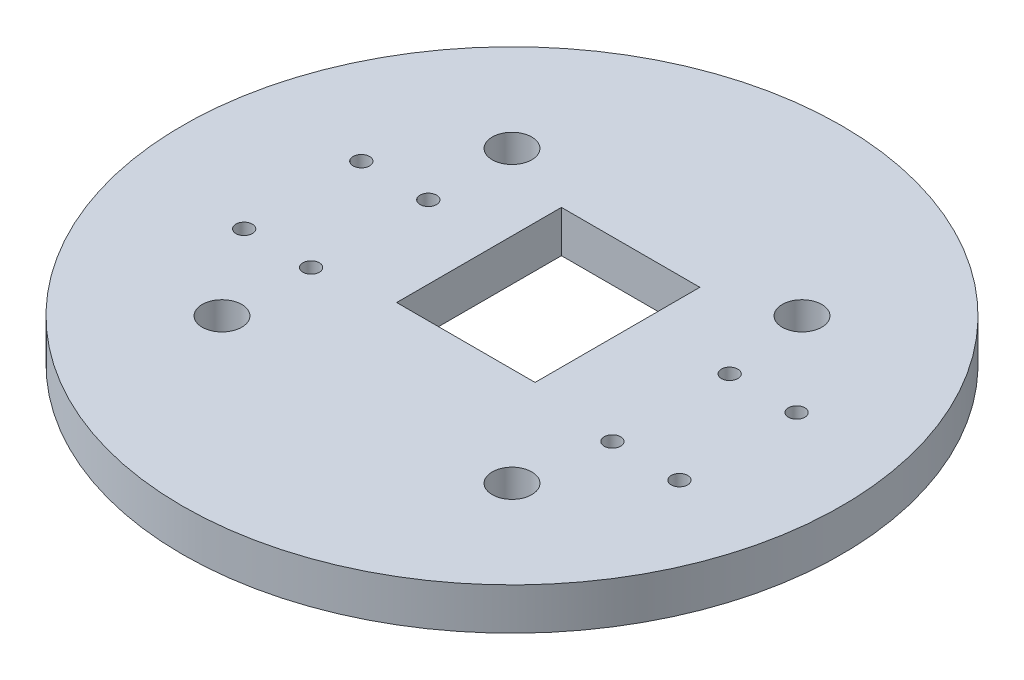
ISO-10303-21;
HEADER;
FILE_DESCRIPTION(('STEP AP214'),'2;1');
FILE_NAME('part.step','',(''),(''),'','','');
FILE_SCHEMA(('AUTOMOTIVE_DESIGN { 1 0 10303 214 1 1 1 1 }'));
ENDSEC;
DATA;
#1=APPLICATION_CONTEXT('core data for automotive mechanical design processes');
#2=APPLICATION_PROTOCOL_DEFINITION('international standard','automotive_design',2000,#1);
#3=PRODUCT_CONTEXT('',#1,'mechanical');
#4=PRODUCT('Part','Part','',(#3));
#5=PRODUCT_RELATED_PRODUCT_CATEGORY('part','',(#4));
#6=PRODUCT_DEFINITION_FORMATION('','',#4);
#7=PRODUCT_DEFINITION_CONTEXT('part definition',#1,'design');
#8=PRODUCT_DEFINITION('design','',#6,#7);
#9=PRODUCT_DEFINITION_SHAPE('','',#8);
#10=(LENGTH_UNIT() NAMED_UNIT(*) SI_UNIT(.MILLI.,.METRE.));
#11=(NAMED_UNIT(*) PLANE_ANGLE_UNIT() SI_UNIT($,.RADIAN.));
#12=(NAMED_UNIT(*) SI_UNIT($,.STERADIAN.) SOLID_ANGLE_UNIT());
#13=UNCERTAINTY_MEASURE_WITH_UNIT(LENGTH_MEASURE(1.E-05),#10,'distance_accuracy_value','');
#14=(GEOMETRIC_REPRESENTATION_CONTEXT(3) GLOBAL_UNCERTAINTY_ASSIGNED_CONTEXT((#13)) GLOBAL_UNIT_ASSIGNED_CONTEXT((#10,
#11,#12)) REPRESENTATION_CONTEXT('',''));
#15=CARTESIAN_POINT('',(0.,0.,0.));
#16=DIRECTION('',(0.,0.,1.));
#17=DIRECTION('',(1.,0.,0.));
#18=AXIS2_PLACEMENT_3D('',#15,#16,#17);
#19=CARTESIAN_POINT('',(0.,6.35,0.));
#20=DIRECTION('',(0.,1.,0.));
#21=DIRECTION('',(0.,0.,1.));
#22=AXIS2_PLACEMENT_3D('',#19,#20,#21);
#23=PLANE('',#22);
#24=CARTESIAN_POINT('',(-21.59,6.35,-8.89));
#25=DIRECTION('',(0.,-1.,0.));
#26=DIRECTION('',(0.,0.,-1.));
#27=AXIS2_PLACEMENT_3D('',#24,#25,#26);
#28=CIRCLE('',#27,1.25);
#29=CARTESIAN_POINT('',(-21.59,6.35,-10.14));
#30=VERTEX_POINT('',#29);
#31=EDGE_CURVE('E161',#30,#30,#28,.T.);
#32=ORIENTED_EDGE('',*,*,#31,.T.);
#33=EDGE_LOOP('',(#32));
#34=FACE_BOUND('',#33,.T.);
#35=CARTESIAN_POINT('',(24.13,6.35,-8.88999999999999));
#36=DIRECTION('',(0.,-1.,0.));
#37=DIRECTION('',(0.,0.,-1.));
#38=AXIS2_PLACEMENT_3D('',#35,#36,#37);
#39=CIRCLE('',#38,1.25);
#40=CARTESIAN_POINT('',(24.13,6.35,-10.14));
#41=VERTEX_POINT('',#40);
#42=EDGE_CURVE('E165',#41,#41,#39,.T.);
#43=ORIENTED_EDGE('',*,*,#42,.T.);
#44=EDGE_LOOP('',(#43));
#45=FACE_BOUND('',#44,.T.);
#46=CARTESIAN_POINT('',(24.13,6.35,8.89000000000001));
#47=DIRECTION('',(0.,-1.,0.));
#48=DIRECTION('',(0.,0.,-1.));
#49=AXIS2_PLACEMENT_3D('',#46,#47,#48);
#50=CIRCLE('',#49,1.25);
#51=CARTESIAN_POINT('',(24.13,6.35,7.64000000000001));
#52=VERTEX_POINT('',#51);
#53=EDGE_CURVE('E169',#52,#52,#50,.T.);
#54=ORIENTED_EDGE('',*,*,#53,.T.);
#55=EDGE_LOOP('',(#54));
#56=FACE_BOUND('',#55,.T.);
#57=CARTESIAN_POINT('',(-21.59,6.35,8.89));
#58=DIRECTION('',(0.,-1.,0.));
#59=DIRECTION('',(0.,0.,-1.));
#60=AXIS2_PLACEMENT_3D('',#57,#58,#59);
#61=CIRCLE('',#60,1.25);
#62=CARTESIAN_POINT('',(-21.59,6.35,7.64));
#63=VERTEX_POINT('',#62);
#64=EDGE_CURVE('E173',#63,#63,#61,.T.);
#65=ORIENTED_EDGE('',*,*,#64,.T.);
#66=EDGE_LOOP('',(#65));
#67=FACE_BOUND('',#66,.T.);
#68=CARTESIAN_POINT('',(-31.75,6.35,-8.89));
#69=DIRECTION('',(0.,-1.,0.));
#70=DIRECTION('',(0.,0.,-1.));
#71=AXIS2_PLACEMENT_3D('',#68,#69,#70);
#72=CIRCLE('',#71,1.25);
#73=CARTESIAN_POINT('',(-31.75,6.35,-10.14));
#74=VERTEX_POINT('',#73);
#75=EDGE_CURVE('E177',#74,#74,#72,.T.);
#76=ORIENTED_EDGE('',*,*,#75,.T.);
#77=EDGE_LOOP('',(#76));
#78=FACE_BOUND('',#77,.T.);
#79=CARTESIAN_POINT('',(34.29,6.35,-8.88999999999999));
#80=DIRECTION('',(0.,-1.,0.));
#81=DIRECTION('',(0.,0.,-1.));
#82=AXIS2_PLACEMENT_3D('',#79,#80,#81);
#83=CIRCLE('',#82,1.25);
#84=CARTESIAN_POINT('',(34.29,6.35,-10.14));
#85=VERTEX_POINT('',#84);
#86=EDGE_CURVE('E181',#85,#85,#83,.T.);
#87=ORIENTED_EDGE('',*,*,#86,.T.);
#88=EDGE_LOOP('',(#87));
#89=FACE_BOUND('',#88,.T.);
#90=CARTESIAN_POINT('',(-31.75,6.35,8.88999999999999));
#91=DIRECTION('',(0.,-1.,0.));
#92=DIRECTION('',(0.,0.,-1.));
#93=AXIS2_PLACEMENT_3D('',#90,#91,#92);
#94=CIRCLE('',#93,1.25);
#95=CARTESIAN_POINT('',(-31.75,6.35,7.63999999999999));
#96=VERTEX_POINT('',#95);
#97=EDGE_CURVE('E185',#96,#96,#94,.T.);
#98=ORIENTED_EDGE('',*,*,#97,.T.);
#99=EDGE_LOOP('',(#98));
#100=FACE_BOUND('',#99,.T.);
#101=CARTESIAN_POINT('',(34.29,6.35,8.88999999999998));
#102=DIRECTION('',(0.,-1.,0.));
#103=DIRECTION('',(0.,0.,-1.));
#104=AXIS2_PLACEMENT_3D('',#101,#102,#103);
#105=CIRCLE('',#104,1.25);
#106=CARTESIAN_POINT('',(34.29,6.35,7.63999999999998));
#107=VERTEX_POINT('',#106);
#108=EDGE_CURVE('E101',#107,#107,#105,.T.);
#109=ORIENTED_EDGE('',*,*,#108,.T.);
#110=EDGE_LOOP('',(#109));
#111=FACE_BOUND('',#110,.T.);
#112=CARTESIAN_POINT('',(22.,6.35,22.));
#113=DIRECTION('',(0.,1.,0.));
#114=DIRECTION('',(0.,0.,1.));
#115=AXIS2_PLACEMENT_3D('',#112,#113,#114);
#116=CIRCLE('',#115,3.);
#117=CARTESIAN_POINT('',(22.,6.35,25.));
#118=VERTEX_POINT('',#117);
#119=EDGE_CURVE('E111',#118,#118,#116,.T.);
#120=ORIENTED_EDGE('',*,*,#119,.F.);
#121=EDGE_LOOP('',(#120));
#122=FACE_BOUND('',#121,.T.);
#123=CARTESIAN_POINT('',(-22.,6.35,-22.));
#124=DIRECTION('',(0.,1.,0.));
#125=DIRECTION('',(0.,0.,1.));
#126=AXIS2_PLACEMENT_3D('',#123,#124,#125);
#127=CIRCLE('',#126,3.);
#128=CARTESIAN_POINT('',(-22.,6.35,-19.));
#129=VERTEX_POINT('',#128);
#130=EDGE_CURVE('E123',#129,#129,#127,.T.);
#131=ORIENTED_EDGE('',*,*,#130,.F.);
#132=EDGE_LOOP('',(#131));
#133=FACE_BOUND('',#132,.T.);
#134=CARTESIAN_POINT('',(0.,6.35,0.));
#135=DIRECTION('',(0.,1.,0.));
#136=DIRECTION('',(0.,0.,1.));
#137=AXIS2_PLACEMENT_3D('',#134,#135,#136);
#138=CIRCLE('',#137,50.);
#139=CARTESIAN_POINT('',(0.,6.35,50.));
#140=VERTEX_POINT('',#139);
#141=EDGE_CURVE('E11',#140,#140,#138,.T.);
#142=ORIENTED_EDGE('',*,*,#141,.T.);
#143=EDGE_LOOP('',(#142));
#144=FACE_BOUND('',#143,.T.);
#145=CARTESIAN_POINT('',(22.,6.35,-22.));
#146=DIRECTION('',(0.,1.,0.));
#147=DIRECTION('',(0.,0.,1.));
#148=AXIS2_PLACEMENT_3D('',#145,#146,#147);
#149=CIRCLE('',#148,3.);
#150=CARTESIAN_POINT('',(22.,6.35,-19.));
#151=VERTEX_POINT('',#150);
#152=EDGE_CURVE('E129',#151,#151,#149,.T.);
#153=ORIENTED_EDGE('',*,*,#152,.F.);
#154=EDGE_LOOP('',(#153));
#155=FACE_BOUND('',#154,.T.);
#156=CARTESIAN_POINT('',(-22.,6.35,22.));
#157=DIRECTION('',(0.,1.,0.));
#158=DIRECTION('',(0.,0.,1.));
#159=AXIS2_PLACEMENT_3D('',#156,#157,#158);
#160=CIRCLE('',#159,3.);
#161=CARTESIAN_POINT('',(-22.,6.35,25.));
#162=VERTEX_POINT('',#161);
#163=EDGE_CURVE('E117',#162,#162,#160,.T.);
#164=ORIENTED_EDGE('',*,*,#163,.F.);
#165=EDGE_LOOP('',(#164));
#166=FACE_BOUND('',#165,.T.);
#167=DIRECTION('',(1.,0.,0.));
#168=VECTOR('',#167,1.);
#169=CARTESIAN_POINT('',(-10.5,6.35,7.00000000000001));
#170=LINE('',#169,#168);
#171=CARTESIAN_POINT('',(-10.5,6.35,7.00000000000001));
#172=VERTEX_POINT('',#171);
#173=CARTESIAN_POINT('',(10.5,6.35,7.00000000000001));
#174=VERTEX_POINT('',#173);
#175=EDGE_CURVE('E81',#172,#174,#170,.T.);
#176=ORIENTED_EDGE('',*,*,#175,.F.);
#177=DIRECTION('',(0.,0.,1.));
#178=VECTOR('',#177,1.);
#179=CARTESIAN_POINT('',(-10.5,6.35,7.00000000000001));
#180=LINE('',#179,#178);
#181=CARTESIAN_POINT('',(-10.5,6.35,-18.));
#182=VERTEX_POINT('',#181);
#183=EDGE_CURVE('E73',#182,#172,#180,.T.);
#184=ORIENTED_EDGE('',*,*,#183,.F.);
#185=DIRECTION('',(-1.,0.,0.));
#186=VECTOR('',#185,1.);
#187=CARTESIAN_POINT('',(-10.5,6.35,-18.));
#188=LINE('',#187,#186);
#189=CARTESIAN_POINT('',(10.5,6.35,-18.));
#190=VERTEX_POINT('',#189);
#191=EDGE_CURVE('E95',#190,#182,#188,.T.);
#192=ORIENTED_EDGE('',*,*,#191,.F.);
#193=DIRECTION('',(0.,0.,-1.));
#194=VECTOR('',#193,1.);
#195=CARTESIAN_POINT('',(10.5,6.35,7.00000000000001));
#196=LINE('',#195,#194);
#197=EDGE_CURVE('E93',#174,#190,#196,.T.);
#198=ORIENTED_EDGE('',*,*,#197,.F.);
#199=EDGE_LOOP('',(#176,#184,#192,#198));
#200=FACE_BOUND('',#199,.T.);
#201=ADVANCED_FACE('F32',(#34,#45,#56,#67,#78,#89,#100,#111,#122,#133,#144,#155,#166,#200),#23,.T.);
#202=CARTESIAN_POINT('',(0.,0.,0.));
#203=DIRECTION('',(0.,1.,0.));
#204=DIRECTION('',(0.,0.,1.));
#205=AXIS2_PLACEMENT_3D('',#202,#203,#204);
#206=PLANE('',#205);
#207=CARTESIAN_POINT('',(-21.59,0.,-8.89));
#208=DIRECTION('',(0.,-1.,0.));
#209=DIRECTION('',(0.,0.,-1.));
#210=AXIS2_PLACEMENT_3D('',#207,#208,#209);
#211=CIRCLE('',#210,1.25);
#212=CARTESIAN_POINT('',(-21.59,0.,-10.14));
#213=VERTEX_POINT('',#212);
#214=EDGE_CURVE('E350',#213,#213,#211,.T.);
#215=ORIENTED_EDGE('',*,*,#214,.F.);
#216=EDGE_LOOP('',(#215));
#217=FACE_BOUND('',#216,.T.);
#218=CARTESIAN_POINT('',(24.13,0.,-8.88999999999999));
#219=DIRECTION('',(0.,-1.,0.));
#220=DIRECTION('',(0.,0.,-1.));
#221=AXIS2_PLACEMENT_3D('',#218,#219,#220);
#222=CIRCLE('',#221,1.25);
#223=CARTESIAN_POINT('',(24.13,0.,-10.14));
#224=VERTEX_POINT('',#223);
#225=EDGE_CURVE('E352',#224,#224,#222,.T.);
#226=ORIENTED_EDGE('',*,*,#225,.F.);
#227=EDGE_LOOP('',(#226));
#228=FACE_BOUND('',#227,.T.);
#229=CARTESIAN_POINT('',(24.13,0.,8.89000000000001));
#230=DIRECTION('',(0.,-1.,0.));
#231=DIRECTION('',(0.,0.,-1.));
#232=AXIS2_PLACEMENT_3D('',#229,#230,#231);
#233=CIRCLE('',#232,1.25);
#234=CARTESIAN_POINT('',(24.13,0.,7.64000000000001));
#235=VERTEX_POINT('',#234);
#236=EDGE_CURVE('E358',#235,#235,#233,.T.);
#237=ORIENTED_EDGE('',*,*,#236,.F.);
#238=EDGE_LOOP('',(#237));
#239=FACE_BOUND('',#238,.T.);
#240=CARTESIAN_POINT('',(-21.59,0.,8.89));
#241=DIRECTION('',(0.,-1.,0.));
#242=DIRECTION('',(0.,0.,-1.));
#243=AXIS2_PLACEMENT_3D('',#240,#241,#242);
#244=CIRCLE('',#243,1.25);
#245=CARTESIAN_POINT('',(-21.59,0.,7.64));
#246=VERTEX_POINT('',#245);
#247=EDGE_CURVE('E362',#246,#246,#244,.T.);
#248=ORIENTED_EDGE('',*,*,#247,.F.);
#249=EDGE_LOOP('',(#248));
#250=FACE_BOUND('',#249,.T.);
#251=CARTESIAN_POINT('',(-31.75,0.,-8.89));
#252=DIRECTION('',(0.,-1.,0.));
#253=DIRECTION('',(0.,0.,-1.));
#254=AXIS2_PLACEMENT_3D('',#251,#252,#253);
#255=CIRCLE('',#254,1.25);
#256=CARTESIAN_POINT('',(-31.75,0.,-10.14));
#257=VERTEX_POINT('',#256);
#258=EDGE_CURVE('E366',#257,#257,#255,.T.);
#259=ORIENTED_EDGE('',*,*,#258,.F.);
#260=EDGE_LOOP('',(#259));
#261=FACE_BOUND('',#260,.T.);
#262=CARTESIAN_POINT('',(34.29,0.,-8.88999999999999));
#263=DIRECTION('',(0.,-1.,0.));
#264=DIRECTION('',(0.,0.,-1.));
#265=AXIS2_PLACEMENT_3D('',#262,#263,#264);
#266=CIRCLE('',#265,1.25);
#267=CARTESIAN_POINT('',(34.29,0.,-10.14));
#268=VERTEX_POINT('',#267);
#269=EDGE_CURVE('E370',#268,#268,#266,.T.);
#270=ORIENTED_EDGE('',*,*,#269,.F.);
#271=EDGE_LOOP('',(#270));
#272=FACE_BOUND('',#271,.T.);
#273=CARTESIAN_POINT('',(-31.75,0.,8.88999999999999));
#274=DIRECTION('',(0.,-1.,0.));
#275=DIRECTION('',(0.,0.,-1.));
#276=AXIS2_PLACEMENT_3D('',#273,#274,#275);
#277=CIRCLE('',#276,1.25);
#278=CARTESIAN_POINT('',(-31.75,0.,7.63999999999999));
#279=VERTEX_POINT('',#278);
#280=EDGE_CURVE('E374',#279,#279,#277,.T.);
#281=ORIENTED_EDGE('',*,*,#280,.F.);
#282=EDGE_LOOP('',(#281));
#283=FACE_BOUND('',#282,.T.);
#284=CARTESIAN_POINT('',(34.29,0.,8.88999999999998));
#285=DIRECTION('',(0.,-1.,0.));
#286=DIRECTION('',(0.,0.,-1.));
#287=AXIS2_PLACEMENT_3D('',#284,#285,#286);
#288=CIRCLE('',#287,1.25);
#289=CARTESIAN_POINT('',(34.29,0.,7.63999999999998));
#290=VERTEX_POINT('',#289);
#291=EDGE_CURVE('E378',#290,#290,#288,.T.);
#292=ORIENTED_EDGE('',*,*,#291,.F.);
#293=EDGE_LOOP('',(#292));
#294=FACE_BOUND('',#293,.T.);
#295=CARTESIAN_POINT('',(22.,0.,22.));
#296=DIRECTION('',(0.,1.,0.));
#297=DIRECTION('',(0.,0.,1.));
#298=AXIS2_PLACEMENT_3D('',#295,#296,#297);
#299=CIRCLE('',#298,3.);
#300=CARTESIAN_POINT('',(22.,0.,25.));
#301=VERTEX_POINT('',#300);
#302=EDGE_CURVE('E89',#301,#301,#299,.T.);
#303=ORIENTED_EDGE('',*,*,#302,.T.);
#304=EDGE_LOOP('',(#303));
#305=FACE_BOUND('',#304,.T.);
#306=CARTESIAN_POINT('',(-22.,0.,-22.));
#307=DIRECTION('',(0.,1.,0.));
#308=DIRECTION('',(0.,0.,1.));
#309=AXIS2_PLACEMENT_3D('',#306,#307,#308);
#310=CIRCLE('',#309,3.);
#311=CARTESIAN_POINT('',(-22.,0.,-19.));
#312=VERTEX_POINT('',#311);
#313=EDGE_CURVE('E120',#312,#312,#310,.T.);
#314=ORIENTED_EDGE('',*,*,#313,.T.);
#315=EDGE_LOOP('',(#314));
#316=FACE_BOUND('',#315,.T.);
#317=CARTESIAN_POINT('',(0.,0.,0.));
#318=DIRECTION('',(0.,1.,0.));
#319=DIRECTION('',(0.,0.,1.));
#320=AXIS2_PLACEMENT_3D('',#317,#318,#319);
#321=CIRCLE('',#320,50.);
#322=CARTESIAN_POINT('',(0.,0.,50.));
#323=VERTEX_POINT('',#322);
#324=EDGE_CURVE('E36',#323,#323,#321,.T.);
#325=ORIENTED_EDGE('',*,*,#324,.F.);
#326=EDGE_LOOP('',(#325));
#327=FACE_BOUND('',#326,.T.);
#328=CARTESIAN_POINT('',(22.,0.,-22.));
#329=DIRECTION('',(0.,1.,0.));
#330=DIRECTION('',(0.,0.,1.));
#331=AXIS2_PLACEMENT_3D('',#328,#329,#330);
#332=CIRCLE('',#331,3.);
#333=CARTESIAN_POINT('',(22.,0.,-19.));
#334=VERTEX_POINT('',#333);
#335=EDGE_CURVE('E126',#334,#334,#332,.T.);
#336=ORIENTED_EDGE('',*,*,#335,.T.);
#337=EDGE_LOOP('',(#336));
#338=FACE_BOUND('',#337,.T.);
#339=CARTESIAN_POINT('',(-22.,0.,22.));
#340=DIRECTION('',(0.,1.,0.));
#341=DIRECTION('',(0.,0.,1.));
#342=AXIS2_PLACEMENT_3D('',#339,#340,#341);
#343=CIRCLE('',#342,3.);
#344=CARTESIAN_POINT('',(-22.,0.,25.));
#345=VERTEX_POINT('',#344);
#346=EDGE_CURVE('E114',#345,#345,#343,.T.);
#347=ORIENTED_EDGE('',*,*,#346,.T.);
#348=EDGE_LOOP('',(#347));
#349=FACE_BOUND('',#348,.T.);
#350=DIRECTION('',(0.,0.,1.));
#351=VECTOR('',#350,1.);
#352=CARTESIAN_POINT('',(-10.5,0.,7.00000000000001));
#353=LINE('',#352,#351);
#354=CARTESIAN_POINT('',(-10.5,0.,-18.));
#355=VERTEX_POINT('',#354);
#356=CARTESIAN_POINT('',(-10.5,0.,7.00000000000001));
#357=VERTEX_POINT('',#356);
#358=EDGE_CURVE('E55',#355,#357,#353,.T.);
#359=ORIENTED_EDGE('',*,*,#358,.T.);
#360=DIRECTION('',(1.,0.,0.));
#361=VECTOR('',#360,1.);
#362=CARTESIAN_POINT('',(-10.5,0.,7.00000000000001));
#363=LINE('',#362,#361);
#364=CARTESIAN_POINT('',(10.5,0.,7.00000000000001));
#365=VERTEX_POINT('',#364);
#366=EDGE_CURVE('E88',#357,#365,#363,.T.);
#367=ORIENTED_EDGE('',*,*,#366,.T.);
#368=DIRECTION('',(0.,0.,-1.));
#369=VECTOR('',#368,1.);
#370=CARTESIAN_POINT('',(10.5,0.,7.00000000000001));
#371=LINE('',#370,#369);
#372=CARTESIAN_POINT('',(10.5,0.,-18.));
#373=VERTEX_POINT('',#372);
#374=EDGE_CURVE('E103',#365,#373,#371,.T.);
#375=ORIENTED_EDGE('',*,*,#374,.T.);
#376=DIRECTION('',(-1.,0.,0.));
#377=VECTOR('',#376,1.);
#378=CARTESIAN_POINT('',(-10.5,0.,-18.));
#379=LINE('',#378,#377);
#380=EDGE_CURVE('E82',#373,#355,#379,.T.);
#381=ORIENTED_EDGE('',*,*,#380,.T.);
#382=EDGE_LOOP('',(#359,#367,#375,#381));
#383=FACE_BOUND('',#382,.T.);
#384=ADVANCED_FACE('F135',(#217,#228,#239,#250,#261,#272,#283,#294,#305,#316,#327,#338,#349,
#383),#206,.F.);
#385=CARTESIAN_POINT('',(0.,6.35,0.));
#386=DIRECTION('',(0.,-1.,0.));
#387=DIRECTION('',(0.,0.,-1.));
#388=AXIS2_PLACEMENT_3D('',#385,#386,#387);
#389=CYLINDRICAL_SURFACE('',#388,50.);
#390=ORIENTED_EDGE('',*,*,#141,.F.);
#391=EDGE_LOOP('',(#390));
#392=FACE_BOUND('',#391,.T.);
#393=ORIENTED_EDGE('',*,*,#324,.T.);
#394=EDGE_LOOP('',(#393));
#395=FACE_BOUND('',#394,.T.);
#396=ADVANCED_FACE('F34',(#392,#395),#389,.T.);
#397=CARTESIAN_POINT('',(22.,6.35,-22.));
#398=DIRECTION('',(0.,-1.,0.));
#399=DIRECTION('',(0.,0.,-1.));
#400=AXIS2_PLACEMENT_3D('',#397,#398,#399);
#401=CYLINDRICAL_SURFACE('',#400,3.);
#402=ORIENTED_EDGE('',*,*,#152,.T.);
#403=EDGE_LOOP('',(#402));
#404=FACE_BOUND('',#403,.T.);
#405=ORIENTED_EDGE('',*,*,#335,.F.);
#406=EDGE_LOOP('',(#405));
#407=FACE_BOUND('',#406,.T.);
#408=ADVANCED_FACE('F138',(#404,#407),#401,.F.);
#409=CARTESIAN_POINT('',(-22.,6.35,-22.));
#410=DIRECTION('',(0.,-1.,0.));
#411=DIRECTION('',(0.,0.,-1.));
#412=AXIS2_PLACEMENT_3D('',#409,#410,#411);
#413=CYLINDRICAL_SURFACE('',#412,3.);
#414=ORIENTED_EDGE('',*,*,#130,.T.);
#415=EDGE_LOOP('',(#414));
#416=FACE_BOUND('',#415,.T.);
#417=ORIENTED_EDGE('',*,*,#313,.F.);
#418=EDGE_LOOP('',(#417));
#419=FACE_BOUND('',#418,.T.);
#420=ADVANCED_FACE('F140',(#416,#419),#413,.F.);
#421=CARTESIAN_POINT('',(-22.,6.35,22.));
#422=DIRECTION('',(0.,-1.,0.));
#423=DIRECTION('',(0.,0.,-1.));
#424=AXIS2_PLACEMENT_3D('',#421,#422,#423);
#425=CYLINDRICAL_SURFACE('',#424,3.);
#426=ORIENTED_EDGE('',*,*,#163,.T.);
#427=EDGE_LOOP('',(#426));
#428=FACE_BOUND('',#427,.T.);
#429=ORIENTED_EDGE('',*,*,#346,.F.);
#430=EDGE_LOOP('',(#429));
#431=FACE_BOUND('',#430,.T.);
#432=ADVANCED_FACE('F147',(#428,#431),#425,.F.);
#433=CARTESIAN_POINT('',(22.,6.35,22.));
#434=DIRECTION('',(0.,-1.,0.));
#435=DIRECTION('',(0.,0.,-1.));
#436=AXIS2_PLACEMENT_3D('',#433,#434,#435);
#437=CYLINDRICAL_SURFACE('',#436,3.);
#438=ORIENTED_EDGE('',*,*,#119,.T.);
#439=EDGE_LOOP('',(#438));
#440=FACE_BOUND('',#439,.T.);
#441=ORIENTED_EDGE('',*,*,#302,.F.);
#442=EDGE_LOOP('',(#441));
#443=FACE_BOUND('',#442,.T.);
#444=ADVANCED_FACE('F201',(#440,#443),#437,.F.);
#445=CARTESIAN_POINT('',(-10.5,6.35,7.00000000000001));
#446=DIRECTION('',(1.,0.,0.));
#447=DIRECTION('',(0.,0.,-1.));
#448=AXIS2_PLACEMENT_3D('',#445,#446,#447);
#449=PLANE('',#448);
#450=ORIENTED_EDGE('',*,*,#358,.F.);
#451=DIRECTION('',(0.,-1.,0.));
#452=VECTOR('',#451,1.);
#453=CARTESIAN_POINT('',(-10.5,6.35,-18.));
#454=LINE('',#453,#452);
#455=EDGE_CURVE('E77',#182,#355,#454,.T.);
#456=ORIENTED_EDGE('',*,*,#455,.F.);
#457=ORIENTED_EDGE('',*,*,#183,.T.);
#458=DIRECTION('',(0.,-1.,0.));
#459=VECTOR('',#458,1.);
#460=CARTESIAN_POINT('',(-10.5,6.35,7.00000000000001));
#461=LINE('',#460,#459);
#462=EDGE_CURVE('E76',#172,#357,#461,.T.);
#463=ORIENTED_EDGE('',*,*,#462,.T.);
#464=EDGE_LOOP('',(#450,#456,#457,#463));
#465=FACE_BOUND('',#464,.T.);
#466=ADVANCED_FACE('F75',(#465),#449,.T.);
#467=CARTESIAN_POINT('',(-10.5,6.35,7.00000000000001));
#468=DIRECTION('',(0.,0.,-1.));
#469=DIRECTION('',(-1.,0.,0.));
#470=AXIS2_PLACEMENT_3D('',#467,#468,#469);
#471=PLANE('',#470);
#472=ORIENTED_EDGE('',*,*,#366,.F.);
#473=ORIENTED_EDGE('',*,*,#462,.F.);
#474=ORIENTED_EDGE('',*,*,#175,.T.);
#475=DIRECTION('',(0.,-1.,0.));
#476=VECTOR('',#475,1.);
#477=CARTESIAN_POINT('',(10.5,6.35,7.00000000000001));
#478=LINE('',#477,#476);
#479=EDGE_CURVE('E90',#174,#365,#478,.T.);
#480=ORIENTED_EDGE('',*,*,#479,.T.);
#481=EDGE_LOOP('',(#472,#473,#474,#480));
#482=FACE_BOUND('',#481,.T.);
#483=ADVANCED_FACE('F85',(#482),#471,.T.);
#484=CARTESIAN_POINT('',(10.5,6.35,7.00000000000001));
#485=DIRECTION('',(-1.,0.,0.));
#486=DIRECTION('',(0.,0.,1.));
#487=AXIS2_PLACEMENT_3D('',#484,#485,#486);
#488=PLANE('',#487);
#489=ORIENTED_EDGE('',*,*,#374,.F.);
#490=ORIENTED_EDGE('',*,*,#479,.F.);
#491=ORIENTED_EDGE('',*,*,#197,.T.);
#492=DIRECTION('',(0.,-1.,0.));
#493=VECTOR('',#492,1.);
#494=CARTESIAN_POINT('',(10.5,6.35,-18.));
#495=LINE('',#494,#493);
#496=EDGE_CURVE('E47',#190,#373,#495,.T.);
#497=ORIENTED_EDGE('',*,*,#496,.T.);
#498=EDGE_LOOP('',(#489,#490,#491,#497));
#499=FACE_BOUND('',#498,.T.);
#500=ADVANCED_FACE('F209',(#499),#488,.T.);
#501=CARTESIAN_POINT('',(-10.5,6.35,-18.));
#502=DIRECTION('',(0.,0.,1.));
#503=DIRECTION('',(1.,0.,0.));
#504=AXIS2_PLACEMENT_3D('',#501,#502,#503);
#505=PLANE('',#504);
#506=ORIENTED_EDGE('',*,*,#380,.F.);
#507=ORIENTED_EDGE('',*,*,#496,.F.);
#508=ORIENTED_EDGE('',*,*,#191,.T.);
#509=ORIENTED_EDGE('',*,*,#455,.T.);
#510=EDGE_LOOP('',(#506,#507,#508,#509));
#511=FACE_BOUND('',#510,.T.);
#512=ADVANCED_FACE('F206',(#511),#505,.T.);
#513=CARTESIAN_POINT('',(34.29,0.,8.88999999999998));
#514=DIRECTION('',(0.,-1.,0.));
#515=DIRECTION('',(0.,0.,-1.));
#516=AXIS2_PLACEMENT_3D('',#513,#514,#515);
#517=CYLINDRICAL_SURFACE('',#516,1.25);
#518=ORIENTED_EDGE('',*,*,#108,.F.);
#519=EDGE_LOOP('',(#518));
#520=FACE_BOUND('',#519,.T.);
#521=ORIENTED_EDGE('',*,*,#291,.T.);
#522=EDGE_LOOP('',(#521));
#523=FACE_BOUND('',#522,.T.);
#524=ADVANCED_FACE('F208',(#520,#523),#517,.F.);
#525=CARTESIAN_POINT('',(-31.75,0.,8.88999999999999));
#526=DIRECTION('',(0.,-1.,0.));
#527=DIRECTION('',(0.,0.,-1.));
#528=AXIS2_PLACEMENT_3D('',#525,#526,#527);
#529=CYLINDRICAL_SURFACE('',#528,1.25);
#530=ORIENTED_EDGE('',*,*,#97,.F.);
#531=EDGE_LOOP('',(#530));
#532=FACE_BOUND('',#531,.T.);
#533=ORIENTED_EDGE('',*,*,#280,.T.);
#534=EDGE_LOOP('',(#533));
#535=FACE_BOUND('',#534,.T.);
#536=ADVANCED_FACE('F215',(#532,#535),#529,.F.);
#537=CARTESIAN_POINT('',(34.29,0.,-8.88999999999999));
#538=DIRECTION('',(0.,-1.,0.));
#539=DIRECTION('',(0.,0.,-1.));
#540=AXIS2_PLACEMENT_3D('',#537,#538,#539);
#541=CYLINDRICAL_SURFACE('',#540,1.25);
#542=ORIENTED_EDGE('',*,*,#86,.F.);
#543=EDGE_LOOP('',(#542));
#544=FACE_BOUND('',#543,.T.);
#545=ORIENTED_EDGE('',*,*,#269,.T.);
#546=EDGE_LOOP('',(#545));
#547=FACE_BOUND('',#546,.T.);
#548=ADVANCED_FACE('F284',(#544,#547),#541,.F.);
#549=CARTESIAN_POINT('',(-31.75,0.,-8.89));
#550=DIRECTION('',(0.,-1.,0.));
#551=DIRECTION('',(0.,0.,-1.));
#552=AXIS2_PLACEMENT_3D('',#549,#550,#551);
#553=CYLINDRICAL_SURFACE('',#552,1.25);
#554=ORIENTED_EDGE('',*,*,#75,.F.);
#555=EDGE_LOOP('',(#554));
#556=FACE_BOUND('',#555,.T.);
#557=ORIENTED_EDGE('',*,*,#258,.T.);
#558=EDGE_LOOP('',(#557));
#559=FACE_BOUND('',#558,.T.);
#560=ADVANCED_FACE('F293',(#556,#559),#553,.F.);
#561=CARTESIAN_POINT('',(-21.59,0.,8.89));
#562=DIRECTION('',(0.,-1.,0.));
#563=DIRECTION('',(0.,0.,-1.));
#564=AXIS2_PLACEMENT_3D('',#561,#562,#563);
#565=CYLINDRICAL_SURFACE('',#564,1.25);
#566=ORIENTED_EDGE('',*,*,#64,.F.);
#567=EDGE_LOOP('',(#566));
#568=FACE_BOUND('',#567,.T.);
#569=ORIENTED_EDGE('',*,*,#247,.T.);
#570=EDGE_LOOP('',(#569));
#571=FACE_BOUND('',#570,.T.);
#572=ADVANCED_FACE('F303',(#568,#571),#565,.F.);
#573=CARTESIAN_POINT('',(24.13,0.,8.89000000000001));
#574=DIRECTION('',(0.,-1.,0.));
#575=DIRECTION('',(0.,0.,-1.));
#576=AXIS2_PLACEMENT_3D('',#573,#574,#575);
#577=CYLINDRICAL_SURFACE('',#576,1.25);
#578=ORIENTED_EDGE('',*,*,#53,.F.);
#579=EDGE_LOOP('',(#578));
#580=FACE_BOUND('',#579,.T.);
#581=ORIENTED_EDGE('',*,*,#236,.T.);
#582=EDGE_LOOP('',(#581));
#583=FACE_BOUND('',#582,.T.);
#584=ADVANCED_FACE('F313',(#580,#583),#577,.F.);
#585=CARTESIAN_POINT('',(24.13,0.,-8.88999999999999));
#586=DIRECTION('',(0.,-1.,0.));
#587=DIRECTION('',(0.,0.,-1.));
#588=AXIS2_PLACEMENT_3D('',#585,#586,#587);
#589=CYLINDRICAL_SURFACE('',#588,1.25);
#590=ORIENTED_EDGE('',*,*,#42,.F.);
#591=EDGE_LOOP('',(#590));
#592=FACE_BOUND('',#591,.T.);
#593=ORIENTED_EDGE('',*,*,#225,.T.);
#594=EDGE_LOOP('',(#593));
#595=FACE_BOUND('',#594,.T.);
#596=ADVANCED_FACE('F323',(#592,#595),#589,.F.);
#597=CARTESIAN_POINT('',(-21.59,0.,-8.89));
#598=DIRECTION('',(0.,-1.,0.));
#599=DIRECTION('',(0.,0.,-1.));
#600=AXIS2_PLACEMENT_3D('',#597,#598,#599);
#601=CYLINDRICAL_SURFACE('',#600,1.25);
#602=ORIENTED_EDGE('',*,*,#31,.F.);
#603=EDGE_LOOP('',(#602));
#604=FACE_BOUND('',#603,.T.);
#605=ORIENTED_EDGE('',*,*,#214,.T.);
#606=EDGE_LOOP('',(#605));
#607=FACE_BOUND('',#606,.T.);
#608=ADVANCED_FACE('F333',(#604,#607),#601,.F.);
#609=CLOSED_SHELL('',(#201,#384,#396,#408,#420,#432,#444,#466,#483,#500,#512,#524,#536,#548,
#560,#572,#584,#596,#608));
#610=MANIFOLD_SOLID_BREP('B2',#609);
#611=ADVANCED_BREP_SHAPE_REPRESENTATION('',(#18,#610),#14);
#612=SHAPE_DEFINITION_REPRESENTATION(#9,#611);
ENDSEC;
END-ISO-10303-21;
